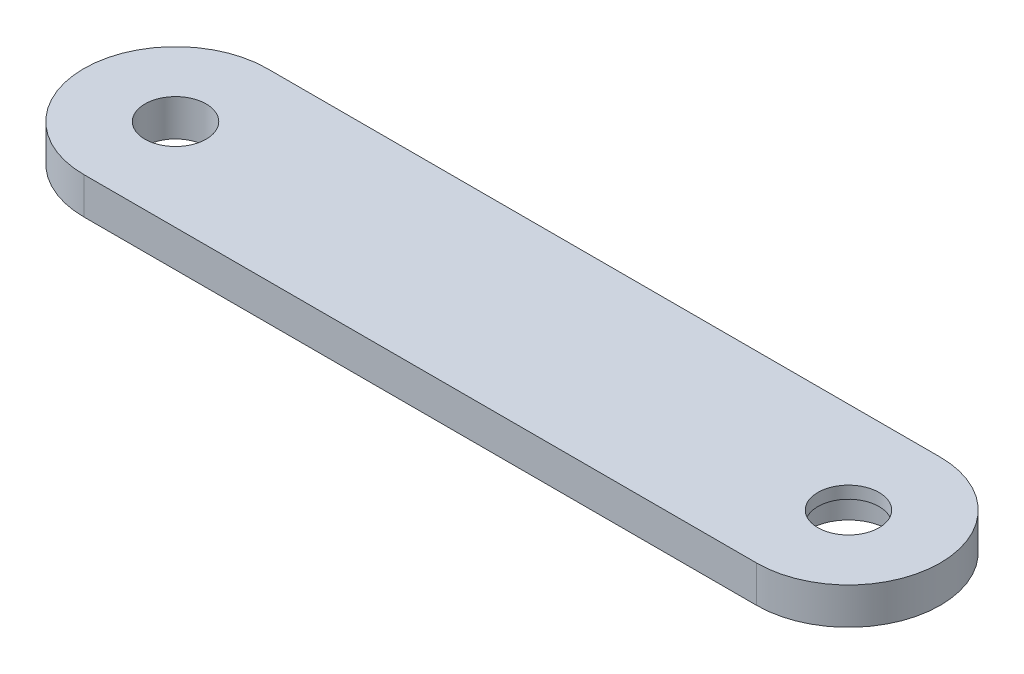
ISO-10303-21;
HEADER;
FILE_DESCRIPTION(('STEP AP214'),'2;1');
FILE_NAME('part.step','',(''),(''),'','','');
FILE_SCHEMA(('AUTOMOTIVE_DESIGN { 1 0 10303 214 1 1 1 1 }'));
ENDSEC;
DATA;
#1=APPLICATION_CONTEXT('core data for automotive mechanical design processes');
#2=APPLICATION_PROTOCOL_DEFINITION('international standard','automotive_design',2000,#1);
#3=PRODUCT_CONTEXT('',#1,'mechanical');
#4=PRODUCT('Part','Part','',(#3));
#5=PRODUCT_RELATED_PRODUCT_CATEGORY('part','',(#4));
#6=PRODUCT_DEFINITION_FORMATION('','',#4);
#7=PRODUCT_DEFINITION_CONTEXT('part definition',#1,'design');
#8=PRODUCT_DEFINITION('design','',#6,#7);
#9=PRODUCT_DEFINITION_SHAPE('','',#8);
#10=(LENGTH_UNIT() NAMED_UNIT(*) SI_UNIT(.MILLI.,.METRE.));
#11=(NAMED_UNIT(*) PLANE_ANGLE_UNIT() SI_UNIT($,.RADIAN.));
#12=(NAMED_UNIT(*) SI_UNIT($,.STERADIAN.) SOLID_ANGLE_UNIT());
#13=UNCERTAINTY_MEASURE_WITH_UNIT(LENGTH_MEASURE(1.E-05),#10,'distance_accuracy_value','');
#14=(GEOMETRIC_REPRESENTATION_CONTEXT(3) GLOBAL_UNCERTAINTY_ASSIGNED_CONTEXT((#13)) GLOBAL_UNIT_ASSIGNED_CONTEXT((#10,
#11,#12)) REPRESENTATION_CONTEXT('',''));
#15=CARTESIAN_POINT('',(0.,0.,0.));
#16=DIRECTION('',(0.,0.,1.));
#17=DIRECTION('',(1.,0.,0.));
#18=AXIS2_PLACEMENT_3D('',#15,#16,#17);
#19=CARTESIAN_POINT('',(65.,6.,0.));
#20=DIRECTION('',(0.,-1.,0.));
#21=DIRECTION('',(0.,0.,-1.));
#22=AXIS2_PLACEMENT_3D('',#19,#20,#21);
#23=CYLINDRICAL_SURFACE('',#22,5.);
#24=CARTESIAN_POINT('',(65.,6.,0.));
#25=DIRECTION('',(0.,1.,0.));
#26=DIRECTION('',(0.,0.,1.));
#27=AXIS2_PLACEMENT_3D('',#24,#25,#26);
#28=CIRCLE('',#27,5.);
#29=CARTESIAN_POINT('',(65.,6.,5.));
#30=VERTEX_POINT('',#29);
#31=EDGE_CURVE('E136',#30,#30,#28,.T.);
#32=ORIENTED_EDGE('',*,*,#31,.T.);
#33=EDGE_LOOP('',(#32));
#34=FACE_BOUND('',#33,.T.);
#35=CARTESIAN_POINT('',(65.,4.,0.));
#36=DIRECTION('',(0.,-1.,0.));
#37=DIRECTION('',(0.,0.,-1.));
#38=AXIS2_PLACEMENT_3D('',#35,#36,#37);
#39=CIRCLE('',#38,5.);
#40=CARTESIAN_POINT('',(65.,4.,-5.));
#41=VERTEX_POINT('',#40);
#42=EDGE_CURVE('E42',#41,#41,#39,.T.);
#43=ORIENTED_EDGE('',*,*,#42,.T.);
#44=EDGE_LOOP('',(#43));
#45=FACE_BOUND('',#44,.T.);
#46=ADVANCED_FACE('F38',(#34,#45),#23,.F.);
#47=CARTESIAN_POINT('',(65.,6.,0.));
#48=DIRECTION('',(0.,1.,0.));
#49=DIRECTION('',(0.,0.,1.));
#50=AXIS2_PLACEMENT_3D('',#47,#48,#49);
#51=PLANE('',#50);
#52=CARTESIAN_POINT('',(-45.,6.,0.));
#53=DIRECTION('',(0.,1.,0.));
#54=DIRECTION('',(0.,0.,1.));
#55=AXIS2_PLACEMENT_3D('',#52,#53,#54);
#56=CIRCLE('',#55,5.);
#57=CARTESIAN_POINT('',(-45.,6.,5.));
#58=VERTEX_POINT('',#57);
#59=EDGE_CURVE('E114',#58,#58,#56,.T.);
#60=ORIENTED_EDGE('',*,*,#59,.F.);
#61=EDGE_LOOP('',(#60));
#62=FACE_BOUND('',#61,.T.);
#63=CARTESIAN_POINT('',(65.,6.,0.));
#64=DIRECTION('',(0.,1.,0.));
#65=DIRECTION('',(0.,0.,1.));
#66=AXIS2_PLACEMENT_3D('',#63,#64,#65);
#67=CIRCLE('',#66,15.);
#68=CARTESIAN_POINT('',(65.,6.,15.));
#69=VERTEX_POINT('',#68);
#70=CARTESIAN_POINT('',(65.,6.,-15.));
#71=VERTEX_POINT('',#70);
#72=EDGE_CURVE('E93',#69,#71,#67,.T.);
#73=ORIENTED_EDGE('',*,*,#72,.T.);
#74=DIRECTION('',(-1.,0.,0.));
#75=VECTOR('',#74,1.);
#76=CARTESIAN_POINT('',(-45.,6.,-15.));
#77=LINE('',#76,#75);
#78=CARTESIAN_POINT('',(-45.,6.,-15.));
#79=VERTEX_POINT('',#78);
#80=EDGE_CURVE('E87',#71,#79,#77,.T.);
#81=ORIENTED_EDGE('',*,*,#80,.T.);
#82=CARTESIAN_POINT('',(-45.,6.,0.));
#83=DIRECTION('',(0.,1.,0.));
#84=DIRECTION('',(0.,0.,1.));
#85=AXIS2_PLACEMENT_3D('',#82,#83,#84);
#86=CIRCLE('',#85,15.);
#87=CARTESIAN_POINT('',(-45.,6.,15.));
#88=VERTEX_POINT('',#87);
#89=EDGE_CURVE('E91',#79,#88,#86,.T.);
#90=ORIENTED_EDGE('',*,*,#89,.T.);
#91=DIRECTION('',(1.,0.,0.));
#92=VECTOR('',#91,1.);
#93=CARTESIAN_POINT('',(-45.,6.,15.));
#94=LINE('',#93,#92);
#95=EDGE_CURVE('E57',#88,#69,#94,.T.);
#96=ORIENTED_EDGE('',*,*,#95,.T.);
#97=EDGE_LOOP('',(#73,#81,#90,#96));
#98=FACE_BOUND('',#97,.T.);
#99=ORIENTED_EDGE('',*,*,#31,.F.);
#100=EDGE_LOOP('',(#99));
#101=FACE_BOUND('',#100,.T.);
#102=ADVANCED_FACE('F88',(#62,#98,#101),#51,.T.);
#103=CARTESIAN_POINT('',(65.,0.,0.));
#104=DIRECTION('',(0.,1.,0.));
#105=DIRECTION('',(0.,0.,1.));
#106=AXIS2_PLACEMENT_3D('',#103,#104,#105);
#107=PLANE('',#106);
#108=CARTESIAN_POINT('',(65.,0.,0.));
#109=DIRECTION('',(0.,-1.,0.));
#110=DIRECTION('',(0.,0.,-1.));
#111=AXIS2_PLACEMENT_3D('',#108,#109,#110);
#112=CIRCLE('',#111,6.5);
#113=CARTESIAN_POINT('',(65.,0.,-6.5));
#114=VERTEX_POINT('',#113);
#115=EDGE_CURVE('E143',#114,#114,#112,.T.);
#116=ORIENTED_EDGE('',*,*,#115,.F.);
#117=EDGE_LOOP('',(#116));
#118=FACE_BOUND('',#117,.T.);
#119=CARTESIAN_POINT('',(65.,0.,0.));
#120=DIRECTION('',(0.,1.,0.));
#121=DIRECTION('',(0.,0.,1.));
#122=AXIS2_PLACEMENT_3D('',#119,#120,#121);
#123=CIRCLE('',#122,15.);
#124=CARTESIAN_POINT('',(65.,0.,15.));
#125=VERTEX_POINT('',#124);
#126=CARTESIAN_POINT('',(65.,0.,-15.));
#127=VERTEX_POINT('',#126);
#128=EDGE_CURVE('E110',#125,#127,#123,.T.);
#129=ORIENTED_EDGE('',*,*,#128,.F.);
#130=DIRECTION('',(1.,0.,0.));
#131=VECTOR('',#130,1.);
#132=CARTESIAN_POINT('',(-45.,0.,15.));
#133=LINE('',#132,#131);
#134=CARTESIAN_POINT('',(-45.,0.,15.));
#135=VERTEX_POINT('',#134);
#136=EDGE_CURVE('E80',#135,#125,#133,.T.);
#137=ORIENTED_EDGE('',*,*,#136,.F.);
#138=CARTESIAN_POINT('',(-45.,0.,0.));
#139=DIRECTION('',(0.,1.,0.));
#140=DIRECTION('',(0.,0.,1.));
#141=AXIS2_PLACEMENT_3D('',#138,#139,#140);
#142=CIRCLE('',#141,15.);
#143=CARTESIAN_POINT('',(-45.,0.,-15.));
#144=VERTEX_POINT('',#143);
#145=EDGE_CURVE('E74',#144,#135,#142,.T.);
#146=ORIENTED_EDGE('',*,*,#145,.F.);
#147=DIRECTION('',(-1.,0.,0.));
#148=VECTOR('',#147,1.);
#149=CARTESIAN_POINT('',(-45.,0.,-15.));
#150=LINE('',#149,#148);
#151=EDGE_CURVE('E98',#127,#144,#150,.T.);
#152=ORIENTED_EDGE('',*,*,#151,.F.);
#153=EDGE_LOOP('',(#129,#137,#146,#152));
#154=FACE_BOUND('',#153,.T.);
#155=CARTESIAN_POINT('',(-45.,0.,0.));
#156=DIRECTION('',(0.,1.,0.));
#157=DIRECTION('',(0.,0.,1.));
#158=AXIS2_PLACEMENT_3D('',#155,#156,#157);
#159=CIRCLE('',#158,5.);
#160=CARTESIAN_POINT('',(-45.,0.,5.));
#161=VERTEX_POINT('',#160);
#162=EDGE_CURVE('E132',#161,#161,#159,.T.);
#163=ORIENTED_EDGE('',*,*,#162,.T.);
#164=EDGE_LOOP('',(#163));
#165=FACE_BOUND('',#164,.T.);
#166=ADVANCED_FACE('F127',(#118,#154,#165),#107,.F.);
#167=CARTESIAN_POINT('',(65.,6.,0.));
#168=DIRECTION('',(0.,-1.,0.));
#169=DIRECTION('',(0.,0.,-1.));
#170=AXIS2_PLACEMENT_3D('',#167,#168,#169);
#171=CYLINDRICAL_SURFACE('',#170,15.);
#172=ORIENTED_EDGE('',*,*,#128,.T.);
#173=DIRECTION('',(0.,-1.,0.));
#174=VECTOR('',#173,1.);
#175=CARTESIAN_POINT('',(65.,6.,-15.));
#176=LINE('',#175,#174);
#177=EDGE_CURVE('E11',#71,#127,#176,.T.);
#178=ORIENTED_EDGE('',*,*,#177,.F.);
#179=ORIENTED_EDGE('',*,*,#72,.F.);
#180=DIRECTION('',(0.,-1.,0.));
#181=VECTOR('',#180,1.);
#182=CARTESIAN_POINT('',(65.,6.,15.));
#183=LINE('',#182,#181);
#184=EDGE_CURVE('E106',#69,#125,#183,.T.);
#185=ORIENTED_EDGE('',*,*,#184,.T.);
#186=EDGE_LOOP('',(#172,#178,#179,#185));
#187=FACE_BOUND('',#186,.T.);
#188=ADVANCED_FACE('F40',(#187),#171,.T.);
#189=CARTESIAN_POINT('',(-45.,6.,-15.));
#190=DIRECTION('',(0.,0.,1.));
#191=DIRECTION('',(1.,0.,0.));
#192=AXIS2_PLACEMENT_3D('',#189,#190,#191);
#193=PLANE('',#192);
#194=ORIENTED_EDGE('',*,*,#151,.T.);
#195=DIRECTION('',(0.,-1.,0.));
#196=VECTOR('',#195,1.);
#197=CARTESIAN_POINT('',(-45.,6.,-15.));
#198=LINE('',#197,#196);
#199=EDGE_CURVE('E49',#79,#144,#198,.T.);
#200=ORIENTED_EDGE('',*,*,#199,.F.);
#201=ORIENTED_EDGE('',*,*,#80,.F.);
#202=ORIENTED_EDGE('',*,*,#177,.T.);
#203=EDGE_LOOP('',(#194,#200,#201,#202));
#204=FACE_BOUND('',#203,.T.);
#205=ADVANCED_FACE('F97',(#204),#193,.F.);
#206=CARTESIAN_POINT('',(-45.,6.,0.));
#207=DIRECTION('',(0.,-1.,0.));
#208=DIRECTION('',(0.,0.,-1.));
#209=AXIS2_PLACEMENT_3D('',#206,#207,#208);
#210=CYLINDRICAL_SURFACE('',#209,15.);
#211=ORIENTED_EDGE('',*,*,#145,.T.);
#212=DIRECTION('',(0.,-1.,0.));
#213=VECTOR('',#212,1.);
#214=CARTESIAN_POINT('',(-45.,6.,15.));
#215=LINE('',#214,#213);
#216=EDGE_CURVE('E100',#88,#135,#215,.T.);
#217=ORIENTED_EDGE('',*,*,#216,.F.);
#218=ORIENTED_EDGE('',*,*,#89,.F.);
#219=ORIENTED_EDGE('',*,*,#199,.T.);
#220=EDGE_LOOP('',(#211,#217,#218,#219));
#221=FACE_BOUND('',#220,.T.);
#222=ADVANCED_FACE('F102',(#221),#210,.T.);
#223=CARTESIAN_POINT('',(-45.,6.,15.));
#224=DIRECTION('',(0.,0.,-1.));
#225=DIRECTION('',(-1.,0.,0.));
#226=AXIS2_PLACEMENT_3D('',#223,#224,#225);
#227=PLANE('',#226);
#228=ORIENTED_EDGE('',*,*,#136,.T.);
#229=ORIENTED_EDGE('',*,*,#184,.F.);
#230=ORIENTED_EDGE('',*,*,#95,.F.);
#231=ORIENTED_EDGE('',*,*,#216,.T.);
#232=EDGE_LOOP('',(#228,#229,#230,#231));
#233=FACE_BOUND('',#232,.T.);
#234=ADVANCED_FACE('F124',(#233),#227,.F.);
#235=CARTESIAN_POINT('',(-45.,6.,0.));
#236=DIRECTION('',(0.,-1.,0.));
#237=DIRECTION('',(0.,0.,-1.));
#238=AXIS2_PLACEMENT_3D('',#235,#236,#237);
#239=CYLINDRICAL_SURFACE('',#238,5.);
#240=ORIENTED_EDGE('',*,*,#59,.T.);
#241=EDGE_LOOP('',(#240));
#242=FACE_BOUND('',#241,.T.);
#243=ORIENTED_EDGE('',*,*,#162,.F.);
#244=EDGE_LOOP('',(#243));
#245=FACE_BOUND('',#244,.T.);
#246=ADVANCED_FACE('F164',(#242,#245),#239,.F.);
#247=CARTESIAN_POINT('',(65.,4.,0.));
#248=DIRECTION('',(0.,-1.,0.));
#249=DIRECTION('',(0.,0.,-1.));
#250=AXIS2_PLACEMENT_3D('',#247,#248,#249);
#251=CYLINDRICAL_SURFACE('',#250,6.5);
#252=CARTESIAN_POINT('',(65.,4.,0.));
#253=DIRECTION('',(0.,-1.,0.));
#254=DIRECTION('',(0.,0.,-1.));
#255=AXIS2_PLACEMENT_3D('',#252,#253,#254);
#256=CIRCLE('',#255,6.5);
#257=CARTESIAN_POINT('',(65.,4.,-6.5));
#258=VERTEX_POINT('',#257);
#259=EDGE_CURVE('E147',#258,#258,#256,.T.);
#260=ORIENTED_EDGE('',*,*,#259,.F.);
#261=EDGE_LOOP('',(#260));
#262=FACE_BOUND('',#261,.T.);
#263=ORIENTED_EDGE('',*,*,#115,.T.);
#264=EDGE_LOOP('',(#263));
#265=FACE_BOUND('',#264,.T.);
#266=ADVANCED_FACE('F159',(#262,#265),#251,.F.);
#267=CARTESIAN_POINT('',(65.,4.,0.));
#268=DIRECTION('',(0.,-1.,0.));
#269=DIRECTION('',(0.,0.,-1.));
#270=AXIS2_PLACEMENT_3D('',#267,#268,#269);
#271=PLANE('',#270);
#272=ORIENTED_EDGE('',*,*,#42,.F.);
#273=EDGE_LOOP('',(#272));
#274=FACE_BOUND('',#273,.T.);
#275=ORIENTED_EDGE('',*,*,#259,.T.);
#276=EDGE_LOOP('',(#275));
#277=FACE_BOUND('',#276,.T.);
#278=ADVANCED_FACE('F157',(#274,#277),#271,.T.);
#279=CLOSED_SHELL('',(#46,#102,#166,#188,#205,#222,#234,#246,#266,#278));
#280=MANIFOLD_SOLID_BREP('B2',#279);
#281=ADVANCED_BREP_SHAPE_REPRESENTATION('',(#18,#280),#14);
#282=SHAPE_DEFINITION_REPRESENTATION(#9,#281);
ENDSEC;
END-ISO-10303-21;
